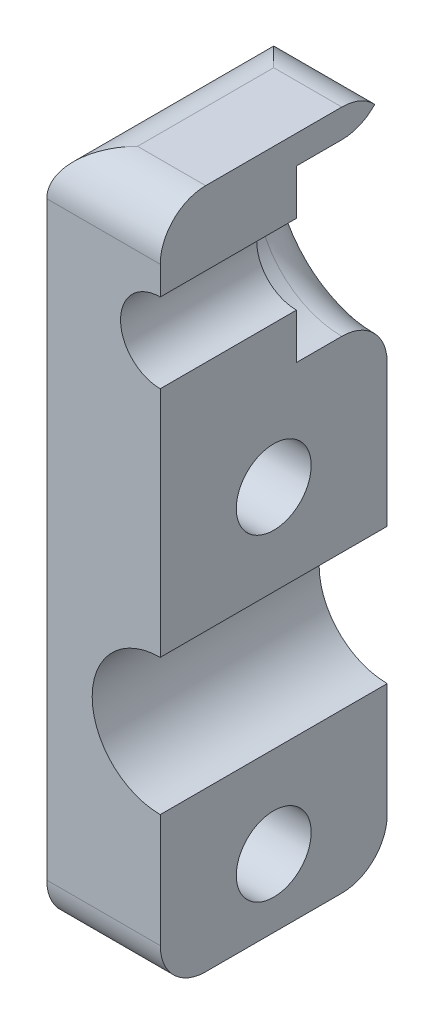
ISO-10303-21;
HEADER;
FILE_DESCRIPTION(('STEP AP214'),'2;1');
FILE_NAME('part.step','',(''),(''),'','','');
FILE_SCHEMA(('AUTOMOTIVE_DESIGN { 1 0 10303 214 1 1 1 1 }'));
ENDSEC;
DATA;
#1=APPLICATION_CONTEXT('core data for automotive mechanical design processes');
#2=APPLICATION_PROTOCOL_DEFINITION('international standard','automotive_design',2000,#1);
#3=PRODUCT_CONTEXT('',#1,'mechanical');
#4=PRODUCT('Part','Part','',(#3));
#5=PRODUCT_RELATED_PRODUCT_CATEGORY('part','',(#4));
#6=PRODUCT_DEFINITION_FORMATION('','',#4);
#7=PRODUCT_DEFINITION_CONTEXT('part definition',#1,'design');
#8=PRODUCT_DEFINITION('design','',#6,#7);
#9=PRODUCT_DEFINITION_SHAPE('','',#8);
#10=(LENGTH_UNIT() NAMED_UNIT(*) SI_UNIT(.MILLI.,.METRE.));
#11=(NAMED_UNIT(*) PLANE_ANGLE_UNIT() SI_UNIT($,.RADIAN.));
#12=(NAMED_UNIT(*) SI_UNIT($,.STERADIAN.) SOLID_ANGLE_UNIT());
#13=UNCERTAINTY_MEASURE_WITH_UNIT(LENGTH_MEASURE(1.E-05),#10,'distance_accuracy_value','');
#14=(GEOMETRIC_REPRESENTATION_CONTEXT(3) GLOBAL_UNCERTAINTY_ASSIGNED_CONTEXT((#13)) GLOBAL_UNIT_ASSIGNED_CONTEXT((#10,
#11,#12)) REPRESENTATION_CONTEXT('',''));
#15=CARTESIAN_POINT('',(0.,0.,0.));
#16=DIRECTION('',(0.,0.,1.));
#17=DIRECTION('',(1.,0.,0.));
#18=AXIS2_PLACEMENT_3D('',#15,#16,#17);
#19=CARTESIAN_POINT('',(0.,0.,0.));
#20=DIRECTION('',(0.,0.,1.));
#21=DIRECTION('',(1.,0.,0.));
#22=AXIS2_PLACEMENT_3D('',#19,#20,#21);
#23=PLANE('',#22);
#24=DIRECTION('',(-1.,0.,0.));
#25=VECTOR('',#24,1.);
#26=CARTESIAN_POINT('',(0.,18.,0.));
#27=LINE('',#26,#25);
#28=CARTESIAN_POINT('',(-5.,18.,0.));
#29=VERTEX_POINT('',#28);
#30=CARTESIAN_POINT('',(-4.90535421758714,18.,0.));
#31=VERTEX_POINT('',#30);
#32=EDGE_CURVE('E285',#29,#31,#27,.F.);
#33=ORIENTED_EDGE('',*,*,#32,.T.);
#34=CARTESIAN_POINT('',(0.,15.,0.));
#35=DIRECTION('',(0.,0.,1.));
#36=DIRECTION('',(1.,0.,0.));
#37=AXIS2_PLACEMENT_3D('',#34,#35,#36);
#38=CIRCLE('',#37,5.75);
#39=CARTESIAN_POINT('',(-5.,17.8394541729001,0.));
#40=VERTEX_POINT('',#39);
#41=EDGE_CURVE('E322',#31,#40,#38,.T.);
#42=ORIENTED_EDGE('',*,*,#41,.T.);
#43=DIRECTION('',(0.,-1.,0.));
#44=VECTOR('',#43,1.);
#45=CARTESIAN_POINT('',(-5.,-10.,0.));
#46=LINE('',#45,#44);
#47=EDGE_CURVE('E248',#29,#40,#46,.T.);
#48=ORIENTED_EDGE('',*,*,#47,.F.);
#49=EDGE_LOOP('',(#33,#42,#48));
#50=FACE_BOUND('',#49,.T.);
#51=ADVANCED_FACE('F38',(#50),#23,.F.);
#52=CARTESIAN_POINT('',(0.,10.,0.));
#53=DIRECTION('',(-1.,0.,0.));
#54=DIRECTION('',(0.,0.,1.));
#55=AXIS2_PLACEMENT_3D('',#52,#53,#54);
#56=PLANE('',#55);
#57=CARTESIAN_POINT('',(0.,7.,5.));
#58=DIRECTION('',(-1.,0.,0.));
#59=DIRECTION('',(0.,0.,1.));
#60=AXIS2_PLACEMENT_3D('',#57,#58,#59);
#61=CIRCLE('',#60,1.65);
#62=CARTESIAN_POINT('',(0.,7.,6.65));
#63=VERTEX_POINT('',#62);
#64=EDGE_CURVE('E206',#63,#63,#61,.F.);
#65=ORIENTED_EDGE('',*,*,#64,.F.);
#66=EDGE_LOOP('',(#65));
#67=FACE_BOUND('',#66,.T.);
#68=DIRECTION('',(0.,-1.,0.));
#69=VECTOR('',#68,1.);
#70=CARTESIAN_POINT('',(0.,10.,0.));
#71=LINE('',#70,#69);
#72=CARTESIAN_POINT('',(0.,9.25,0.));
#73=VERTEX_POINT('',#72);
#74=CARTESIAN_POINT('',(0.,3.,0.));
#75=VERTEX_POINT('',#74);
#76=EDGE_CURVE('E203',#73,#75,#71,.T.);
#77=ORIENTED_EDGE('',*,*,#76,.F.);
#78=CARTESIAN_POINT('',(0.,9.25,2.));
#79=DIRECTION('',(-1.,0.,0.));
#80=DIRECTION('',(0.,0.,1.));
#81=AXIS2_PLACEMENT_3D('',#78,#79,#80);
#82=CIRCLE('',#81,2.);
#83=CARTESIAN_POINT('',(0.,11.25,2.));
#84=VERTEX_POINT('',#83);
#85=EDGE_CURVE('E334',#73,#84,#82,.F.);
#86=ORIENTED_EDGE('',*,*,#85,.T.);
#87=DIRECTION('',(0.,0.,-1.));
#88=VECTOR('',#87,1.);
#89=CARTESIAN_POINT('',(0.,11.25,4.));
#90=LINE('',#89,#88);
#91=CARTESIAN_POINT('',(0.,11.25,4.));
#92=VERTEX_POINT('',#91);
#93=EDGE_CURVE('E162',#92,#84,#90,.T.);
#94=ORIENTED_EDGE('',*,*,#93,.F.);
#95=DIRECTION('',(0.,1.,0.));
#96=VECTOR('',#95,1.);
#97=CARTESIAN_POINT('',(0.,10.,4.));
#98=LINE('',#97,#96);
#99=CARTESIAN_POINT('',(0.,13.25,4.));
#100=VERTEX_POINT('',#99);
#101=EDGE_CURVE('E169',#92,#100,#98,.T.);
#102=ORIENTED_EDGE('',*,*,#101,.T.);
#103=DIRECTION('',(0.,0.,1.));
#104=VECTOR('',#103,1.);
#105=CARTESIAN_POINT('',(0.,13.25,0.));
#106=LINE('',#105,#104);
#107=CARTESIAN_POINT('',(0.,13.25,10.));
#108=VERTEX_POINT('',#107);
#109=EDGE_CURVE('E193',#100,#108,#106,.T.);
#110=ORIENTED_EDGE('',*,*,#109,.T.);
#111=DIRECTION('',(0.,-1.,0.));
#112=VECTOR('',#111,1.);
#113=CARTESIAN_POINT('',(0.,10.,10.));
#114=LINE('',#113,#112);
#115=CARTESIAN_POINT('',(0.,3.,10.));
#116=VERTEX_POINT('',#115);
#117=EDGE_CURVE('E208',#108,#116,#114,.T.);
#118=ORIENTED_EDGE('',*,*,#117,.T.);
#119=DIRECTION('',(0.,0.,-1.));
#120=VECTOR('',#119,1.);
#121=CARTESIAN_POINT('',(0.,3.,10.));
#122=LINE('',#121,#120);
#123=EDGE_CURVE('E218',#116,#75,#122,.T.);
#124=ORIENTED_EDGE('',*,*,#123,.T.);
#125=EDGE_LOOP('',(#77,#86,#94,#102,#110,#118,#124));
#126=FACE_BOUND('',#125,.T.);
#127=ADVANCED_FACE('F372',(#67,#126),#56,.F.);
#128=CARTESIAN_POINT('',(0.,16.75,0.));
#129=DIRECTION('',(1.,0.,0.));
#130=DIRECTION('',(0.,0.,-1.));
#131=AXIS2_PLACEMENT_3D('',#128,#129,#130);
#132=PLANE('',#131);
#133=DIRECTION('',(0.,0.,-1.));
#134=VECTOR('',#133,1.);
#135=CARTESIAN_POINT('',(0.,18.75,4.));
#136=LINE('',#135,#134);
#137=CARTESIAN_POINT('',(0.,18.75,4.));
#138=VERTEX_POINT('',#137);
#139=CARTESIAN_POINT('',(0.,18.75,2.));
#140=VERTEX_POINT('',#139);
#141=EDGE_CURVE('E155',#138,#140,#136,.T.);
#142=ORIENTED_EDGE('',*,*,#141,.T.);
#143=CARTESIAN_POINT('',(0.,20.75,2.));
#144=DIRECTION('',(1.,0.,0.));
#145=DIRECTION('',(0.,0.,-1.));
#146=AXIS2_PLACEMENT_3D('',#143,#144,#145);
#147=CIRCLE('',#146,2.);
#148=CARTESIAN_POINT('',(0.,19.375,0.547631245172217));
#149=VERTEX_POINT('',#148);
#150=EDGE_CURVE('E53',#140,#149,#147,.T.);
#151=ORIENTED_EDGE('',*,*,#150,.T.);
#152=CARTESIAN_POINT('',(0.,18.,2.));
#153=DIRECTION('',(1.,0.,0.));
#154=DIRECTION('',(0.,0.,-1.));
#155=AXIS2_PLACEMENT_3D('',#152,#153,#154);
#156=CIRCLE('',#155,2.);
#157=CARTESIAN_POINT('',(0.,20.,2.));
#158=VERTEX_POINT('',#157);
#159=EDGE_CURVE('E275',#149,#158,#156,.T.);
#160=ORIENTED_EDGE('',*,*,#159,.T.);
#161=DIRECTION('',(0.,0.,1.));
#162=VECTOR('',#161,1.);
#163=CARTESIAN_POINT('',(0.,20.,0.));
#164=LINE('',#163,#162);
#165=CARTESIAN_POINT('',(0.,20.,8.));
#166=VERTEX_POINT('',#165);
#167=EDGE_CURVE('E194',#158,#166,#164,.T.);
#168=ORIENTED_EDGE('',*,*,#167,.T.);
#169=CARTESIAN_POINT('',(0.,18.,8.));
#170=DIRECTION('',(1.,0.,0.));
#171=DIRECTION('',(0.,0.,-1.));
#172=AXIS2_PLACEMENT_3D('',#169,#170,#171);
#173=CIRCLE('',#172,2.);
#174=CARTESIAN_POINT('',(0.,18.,10.));
#175=VERTEX_POINT('',#174);
#176=EDGE_CURVE('E278',#166,#175,#173,.T.);
#177=ORIENTED_EDGE('',*,*,#176,.T.);
#178=DIRECTION('',(0.,1.,0.));
#179=VECTOR('',#178,1.);
#180=CARTESIAN_POINT('',(0.,16.75,10.));
#181=LINE('',#180,#179);
#182=CARTESIAN_POINT('',(0.,16.75,10.));
#183=VERTEX_POINT('',#182);
#184=EDGE_CURVE('E188',#183,#175,#181,.T.);
#185=ORIENTED_EDGE('',*,*,#184,.F.);
#186=DIRECTION('',(0.,0.,1.));
#187=VECTOR('',#186,1.);
#188=CARTESIAN_POINT('',(0.,16.75,0.));
#189=LINE('',#188,#187);
#190=CARTESIAN_POINT('',(0.,16.75,4.));
#191=VERTEX_POINT('',#190);
#192=EDGE_CURVE('E175',#191,#183,#189,.T.);
#193=ORIENTED_EDGE('',*,*,#192,.F.);
#194=DIRECTION('',(0.,-1.,0.));
#195=VECTOR('',#194,1.);
#196=CARTESIAN_POINT('',(0.,16.75,4.));
#197=LINE('',#196,#195);
#198=EDGE_CURVE('E166',#138,#191,#197,.T.);
#199=ORIENTED_EDGE('',*,*,#198,.F.);
#200=EDGE_LOOP('',(#142,#151,#160,#168,#177,#185,#193,#199));
#201=FACE_BOUND('',#200,.T.);
#202=ADVANCED_FACE('F173',(#201),#132,.T.);
#203=CARTESIAN_POINT('',(-5.,18.,2.));
#204=DIRECTION('',(1.,0.,0.));
#205=DIRECTION('',(0.,0.,-1.));
#206=AXIS2_PLACEMENT_3D('',#203,#204,#205);
#207=CYLINDRICAL_SURFACE('',#206,2.);
#208=ORIENTED_EDGE('',*,*,#159,.F.);
#209=CARTESIAN_POINT('',(0.,19.375,0.547631245172218));
#210=CARTESIAN_POINT('',(-0.104557431719242,19.3750058942445,0.547664145378404));
#211=CARTESIAN_POINT('',(-0.209105424218425,19.3731261124907,0.545857579252085));
#212=CARTESIAN_POINT('',(-0.417915039496504,19.3656408977922,0.538811350696752));
#213=CARTESIAN_POINT('',(-0.522176753405376,19.3600368344377,0.533572950321554));
#214=CARTESIAN_POINT('',(-0.729936395654217,19.3451692427591,0.519927411811523));
#215=CARTESIAN_POINT('',(-0.833435637846198,19.3359158577942,0.511529059770388));
#216=CARTESIAN_POINT('',(-1.0397920197455,19.3138275183705,0.491996336406392));
#217=CARTESIAN_POINT('',(-1.14264910290823,19.3009922529368,0.48086172753477));
#218=CARTESIAN_POINT('',(-1.45026658123059,19.2572165551883,0.444088131758686));
#219=CARTESIAN_POINT('',(-1.65389423232931,19.2210192801474,0.415092772692857));
#220=CARTESIAN_POINT('',(-2.0577274131272,19.1353768580384,0.352663854281344));
#221=CARTESIAN_POINT('',(-2.25793034852994,19.0859221031891,0.319227085118304));
#222=CARTESIAN_POINT('',(-2.66837993582481,18.9706964695246,0.249980036452149));
#223=CARTESIAN_POINT('',(-2.87837725016599,18.9040411286758,0.2141638024368));
#224=CARTESIAN_POINT('',(-3.29440958221754,18.7572932347844,0.147159496697465));
#225=CARTESIAN_POINT('',(-3.50044432568652,18.6771997554192,0.115971744305104));
#226=CARTESIAN_POINT('',(-3.90764586560315,18.5048059668876,0.0626590613426096));
#227=CARTESIAN_POINT('',(-4.10882793408878,18.4125522310438,0.0405008103494129));
#228=CARTESIAN_POINT('',(-4.50657842964537,18.2167270088505,0.00930835211263196));
#229=CARTESIAN_POINT('',(-4.70315098626129,18.1131661626594,0.00026191897933822));
#230=CARTESIAN_POINT('',(-4.89972236801897,18.0031559260471,1.87237790598722E-06));
#231=CARTESIAN_POINT('',(-4.90253859153695,18.0015784767274,3.8154487452337E-09));
#232=CARTESIAN_POINT('',(-4.90535421758714,18.,0.));
#233=B_SPLINE_CURVE_WITH_KNOTS('',3,(#209,#210,#211,#212,#213,#214,#215,#216,#217,#218,#219,
#220,#221,#222,#223,#224,#225,#226,#227,#228,#229,#230,#231,#232),.UNSPECIFIED.,.F.,.F.,(4,2,2,
2,2,2,2,2,2,2,2,4),(0.,0.313624479183911,0.627133687953784,0.939777564889495,1.25244859366927,
1.87832878739126,2.50466379251131,3.17382805908076,3.84303847168451,4.50975651797908,
5.17585249363781,5.18553624948097),.UNSPECIFIED.);
#234=EDGE_CURVE('E11',#149,#31,#233,.T.);
#235=ORIENTED_EDGE('',*,*,#234,.T.);
#236=ORIENTED_EDGE('',*,*,#32,.F.);
#237=CARTESIAN_POINT('',(-3.,18.,2.));
#238=DIRECTION('',(0.707106781186547,0.,-0.707106781186547));
#239=DIRECTION('',(-0.707106781186547,0.,-0.707106781186547));
#240=AXIS2_PLACEMENT_3D('',#237,#238,#239);
#241=ELLIPSE('',#240,2.82842712474619,2.);
#242=CARTESIAN_POINT('',(-3.,20.,2.));
#243=VERTEX_POINT('',#242);
#244=EDGE_CURVE('E189',#243,#29,#241,.F.);
#245=ORIENTED_EDGE('',*,*,#244,.F.);
#246=DIRECTION('',(-1.,0.,0.));
#247=VECTOR('',#246,1.);
#248=CARTESIAN_POINT('',(-5.,20.,2.));
#249=LINE('',#248,#247);
#250=EDGE_CURVE('E269',#158,#243,#249,.T.);
#251=ORIENTED_EDGE('',*,*,#250,.F.);
#252=EDGE_LOOP('',(#208,#235,#236,#245,#251));
#253=FACE_BOUND('',#252,.T.);
#254=ADVANCED_FACE('F354',(#253),#207,.T.);
#255=CARTESIAN_POINT('',(0.,0.,10.));
#256=DIRECTION('',(0.,0.,1.));
#257=DIRECTION('',(1.,0.,0.));
#258=AXIS2_PLACEMENT_3D('',#255,#256,#257);
#259=PLANE('',#258);
#260=ORIENTED_EDGE('',*,*,#184,.T.);
#261=DIRECTION('',(-1.,0.,0.));
#262=VECTOR('',#261,1.);
#263=CARTESIAN_POINT('',(0.,18.,10.));
#264=LINE('',#263,#262);
#265=CARTESIAN_POINT('',(-5.,18.,10.));
#266=VERTEX_POINT('',#265);
#267=EDGE_CURVE('E262',#175,#266,#264,.T.);
#268=ORIENTED_EDGE('',*,*,#267,.T.);
#269=DIRECTION('',(0.,-1.,0.));
#270=VECTOR('',#269,1.);
#271=CARTESIAN_POINT('',(-5.,-10.,10.));
#272=LINE('',#271,#270);
#273=CARTESIAN_POINT('',(-5.,-8.,10.));
#274=VERTEX_POINT('',#273);
#275=EDGE_CURVE('E243',#266,#274,#272,.T.);
#276=ORIENTED_EDGE('',*,*,#275,.T.);
#277=DIRECTION('',(1.,0.,0.));
#278=VECTOR('',#277,1.);
#279=CARTESIAN_POINT('',(0.,-8.,10.));
#280=LINE('',#279,#278);
#281=CARTESIAN_POINT('',(0.,-8.,10.));
#282=VERTEX_POINT('',#281);
#283=EDGE_CURVE('E255',#274,#282,#280,.T.);
#284=ORIENTED_EDGE('',*,*,#283,.T.);
#285=CARTESIAN_POINT('',(0.,-3.,10.));
#286=VERTEX_POINT('',#285);
#287=EDGE_CURVE('E198',#286,#282,#114,.T.);
#288=ORIENTED_EDGE('',*,*,#287,.F.);
#289=CARTESIAN_POINT('',(0.,0.,10.));
#290=DIRECTION('',(0.,0.,1.));
#291=DIRECTION('',(1.,0.,0.));
#292=AXIS2_PLACEMENT_3D('',#289,#290,#291);
#293=CIRCLE('',#292,3.);
#294=EDGE_CURVE('E235',#116,#286,#293,.T.);
#295=ORIENTED_EDGE('',*,*,#294,.F.);
#296=ORIENTED_EDGE('',*,*,#117,.F.);
#297=CARTESIAN_POINT('',(0.,15.,10.));
#298=DIRECTION('',(0.,0.,-1.));
#299=DIRECTION('',(1.,0.,0.));
#300=AXIS2_PLACEMENT_3D('',#297,#298,#299);
#301=CIRCLE('',#300,1.75);
#302=EDGE_CURVE('E184',#108,#183,#301,.T.);
#303=ORIENTED_EDGE('',*,*,#302,.T.);
#304=EDGE_LOOP('',(#260,#268,#276,#284,#288,#295,#296,#303));
#305=FACE_BOUND('',#304,.T.);
#306=ADVANCED_FACE('F358',(#305),#259,.T.);
#307=CARTESIAN_POINT('',(-5.,12.1605458270999,0.));
#308=VERTEX_POINT('',#307);
#309=CARTESIAN_POINT('',(-5.,-8.,0.));
#310=VERTEX_POINT('',#309);
#311=EDGE_CURVE('E239',#308,#310,#46,.T.);
#312=ORIENTED_EDGE('',*,*,#311,.F.);
#313=CARTESIAN_POINT('',(0.,15.,0.));
#314=DIRECTION('',(0.,0.,1.));
#315=DIRECTION('',(1.,0.,0.));
#316=AXIS2_PLACEMENT_3D('',#313,#314,#315);
#317=CIRCLE('',#316,5.75);
#318=EDGE_CURVE('E319',#308,#73,#317,.T.);
#319=ORIENTED_EDGE('',*,*,#318,.T.);
#320=ORIENTED_EDGE('',*,*,#76,.T.);
#321=CARTESIAN_POINT('',(0.,0.,0.));
#322=DIRECTION('',(0.,0.,1.));
#323=DIRECTION('',(1.,0.,0.));
#324=AXIS2_PLACEMENT_3D('',#321,#322,#323);
#325=CIRCLE('',#324,3.);
#326=CARTESIAN_POINT('',(0.,-3.,0.));
#327=VERTEX_POINT('',#326);
#328=EDGE_CURVE('E231',#75,#327,#325,.T.);
#329=ORIENTED_EDGE('',*,*,#328,.T.);
#330=CARTESIAN_POINT('',(0.,-8.,0.));
#331=VERTEX_POINT('',#330);
#332=EDGE_CURVE('E207',#327,#331,#71,.T.);
#333=ORIENTED_EDGE('',*,*,#332,.T.);
#334=DIRECTION('',(1.,0.,0.));
#335=VECTOR('',#334,1.);
#336=CARTESIAN_POINT('',(0.,-8.,0.));
#337=LINE('',#336,#335);
#338=EDGE_CURVE('E281',#331,#310,#337,.F.);
#339=ORIENTED_EDGE('',*,*,#338,.T.);
#340=EDGE_LOOP('',(#312,#319,#320,#329,#333,#339));
#341=FACE_BOUND('',#340,.T.);
#342=ADVANCED_FACE('F342',(#341),#23,.F.);
#343=CARTESIAN_POINT('',(-5.,-10.,10.));
#344=DIRECTION('',(1.,0.,0.));
#345=DIRECTION('',(0.,0.,-1.));
#346=AXIS2_PLACEMENT_3D('',#343,#344,#345);
#347=PLANE('',#346);
#348=CARTESIAN_POINT('',(-5.,7.,5.));
#349=DIRECTION('',(-1.,0.,0.));
#350=DIRECTION('',(0.,0.,1.));
#351=AXIS2_PLACEMENT_3D('',#348,#349,#350);
#352=CIRCLE('',#351,1.65);
#353=CARTESIAN_POINT('',(-5.,7.,6.65));
#354=VERTEX_POINT('',#353);
#355=EDGE_CURVE('E227',#354,#354,#352,.T.);
#356=ORIENTED_EDGE('',*,*,#355,.F.);
#357=EDGE_LOOP('',(#356));
#358=FACE_BOUND('',#357,.T.);
#359=CARTESIAN_POINT('',(-5.,-7.,5.));
#360=DIRECTION('',(-1.,0.,0.));
#361=DIRECTION('',(0.,0.,1.));
#362=AXIS2_PLACEMENT_3D('',#359,#360,#361);
#363=CIRCLE('',#362,1.65);
#364=CARTESIAN_POINT('',(-5.,-7.,6.65));
#365=VERTEX_POINT('',#364);
#366=EDGE_CURVE('E226',#365,#365,#363,.T.);
#367=ORIENTED_EDGE('',*,*,#366,.F.);
#368=EDGE_LOOP('',(#367));
#369=FACE_BOUND('',#368,.T.);
#370=ORIENTED_EDGE('',*,*,#47,.T.);
#371=CARTESIAN_POINT('',(-5.,17.8394541729001,0.));
#372=CARTESIAN_POINT('',(-5.,17.7559573230631,1.5059673643392E-06));
#373=CARTESIAN_POINT('',(-5.,17.6724743884027,0.00127486166122521));
#374=CARTESIAN_POINT('',(-5.,17.5056285933237,0.00586466086511358));
#375=CARTESIAN_POINT('',(-5.,17.4222656901372,0.00917949143915023));
#376=CARTESIAN_POINT('',(-5.,17.2556441903361,0.0173520364408328));
#377=CARTESIAN_POINT('',(-5.,17.1723855707008,0.0222093091210928));
#378=CARTESIAN_POINT('',(-5.,17.0058951499512,0.0329841618126697));
#379=CARTESIAN_POINT('',(-5.,16.9226633849223,0.0389022883872981));
#380=CARTESIAN_POINT('',(-5.,16.6722366155333,0.0575814037255051));
#381=CARTESIAN_POINT('',(-5.,16.5051101386614,0.071218626195395));
#382=CARTESIAN_POINT('',(-5.,16.1707516000933,0.0971121286841212));
#383=CARTESIAN_POINT('',(-5.,16.0035195444876,0.109368482134822));
#384=CARTESIAN_POINT('',(-5.,15.6690030306002,0.129326968154269));
#385=CARTESIAN_POINT('',(-5.,15.5017190040156,0.137035713033512));
#386=CARTESIAN_POINT('',(-5.,15.1669917240203,0.145908666501976));
#387=CARTESIAN_POINT('',(-5.,14.9995485048876,0.147074058727873));
#388=CARTESIAN_POINT('',(-5.,14.6648288031768,0.1425540012047));
#389=CARTESIAN_POINT('',(-5.,14.497552281004,0.136871229895289));
#390=CARTESIAN_POINT('',(-5.,14.1632477927315,0.120154943397628));
#391=CARTESIAN_POINT('',(-5.,13.9962199017374,0.109120050597252));
#392=CARTESIAN_POINT('',(-5.,13.6621672343864,0.0845263939112008));
#393=CARTESIAN_POINT('',(-5.,13.4951427027134,0.0709646146373417));
#394=CARTESIAN_POINT('',(-5.,13.1610104624375,0.0448943826760341));
#395=CARTESIAN_POINT('',(-5.,12.9939027617324,0.0323858441431447));
#396=CARTESIAN_POINT('',(-5.,12.7711849940085,0.0190051070471635));
#397=CARTESIAN_POINT('',(-5.,12.7157120844865,0.0159437200288434));
#398=CARTESIAN_POINT('',(-5.,12.6047448860697,0.0105077558482934));
#399=CARTESIAN_POINT('',(-5.,12.5492506048072,0.00813302410736663));
#400=CARTESIAN_POINT('',(-5.,12.4382396677601,0.0042152460184918));
#401=CARTESIAN_POINT('',(-5.,12.382723016427,0.002672078255604));
#402=CARTESIAN_POINT('',(-5.,12.271653825586,0.000564448895834083));
#403=CARTESIAN_POINT('',(-5.,12.216101280279,3.00213052616789E-07));
#404=CARTESIAN_POINT('',(-5.,12.1605458270999,0.));
#405=B_SPLINE_CURVE_WITH_KNOTS('',3,(#371,#372,#373,#374,#375,#376,#377,#378,#379,#380,#381,
#382,#383,#384,#385,#386,#387,#388,#389,#390,#391,#392,#393,#394,#395,#396,#397,#398,#399,#400,
#401,#402,#403,#404),.UNSPECIFIED.,.F.,.F.,(4,2,2,2,2,2,2,2,2,2,2,2,2,2,2,2,4),(0.,
0.250461062038237,0.50072449229396,0.750916312950249,1.00123740755499,1.50428365664162,
2.00730314209132,2.50958941320708,3.01178482209336,3.51378387707528,4.01591221299518,
4.51864363234092,5.02133403631511,5.18800200505312,5.35463242451112,5.52123850800891,
5.68789783234607),.UNSPECIFIED.);
#406=EDGE_CURVE('E326',#40,#308,#405,.T.);
#407=ORIENTED_EDGE('',*,*,#406,.T.);
#408=ORIENTED_EDGE('',*,*,#311,.T.);
#409=CARTESIAN_POINT('',(-5.,-8.,2.));
#410=DIRECTION('',(1.,0.,0.));
#411=DIRECTION('',(0.,0.,-1.));
#412=AXIS2_PLACEMENT_3D('',#409,#410,#411);
#413=CIRCLE('',#412,2.);
#414=CARTESIAN_POINT('',(-5.,-10.,2.));
#415=VERTEX_POINT('',#414);
#416=EDGE_CURVE('E308',#310,#415,#413,.F.);
#417=ORIENTED_EDGE('',*,*,#416,.T.);
#418=DIRECTION('',(0.,0.,-1.));
#419=VECTOR('',#418,1.);
#420=CARTESIAN_POINT('',(-5.,-10.,10.));
#421=LINE('',#420,#419);
#422=CARTESIAN_POINT('',(-5.,-10.,8.));
#423=VERTEX_POINT('',#422);
#424=EDGE_CURVE('E247',#423,#415,#421,.T.);
#425=ORIENTED_EDGE('',*,*,#424,.F.);
#426=CARTESIAN_POINT('',(-5.,-8.,8.));
#427=DIRECTION('',(1.,0.,0.));
#428=DIRECTION('',(0.,0.,-1.));
#429=AXIS2_PLACEMENT_3D('',#426,#427,#428);
#430=CIRCLE('',#429,2.);
#431=EDGE_CURVE('E305',#423,#274,#430,.F.);
#432=ORIENTED_EDGE('',*,*,#431,.T.);
#433=ORIENTED_EDGE('',*,*,#275,.F.);
#434=DIRECTION('',(0.,0.,1.));
#435=VECTOR('',#434,1.);
#436=CARTESIAN_POINT('',(-5.,18.,0.));
#437=LINE('',#436,#435);
#438=EDGE_CURVE('E302',#266,#29,#437,.F.);
#439=ORIENTED_EDGE('',*,*,#438,.T.);
#440=EDGE_LOOP('',(#370,#407,#408,#417,#425,#432,#433,#439));
#441=FACE_BOUND('',#440,.T.);
#442=ADVANCED_FACE('F336',(#358,#369,#441),#347,.F.);
#443=CARTESIAN_POINT('',(5.,-10.,10.));
#444=DIRECTION('',(0.,1.,0.));
#445=DIRECTION('',(0.,0.,1.));
#446=AXIS2_PLACEMENT_3D('',#443,#444,#445);
#447=PLANE('',#446);
#448=ORIENTED_EDGE('',*,*,#424,.T.);
#449=DIRECTION('',(1.,0.,0.));
#450=VECTOR('',#449,1.);
#451=CARTESIAN_POINT('',(5.,-10.,2.));
#452=LINE('',#451,#450);
#453=CARTESIAN_POINT('',(0.,-10.,2.));
#454=VERTEX_POINT('',#453);
#455=EDGE_CURVE('E292',#415,#454,#452,.T.);
#456=ORIENTED_EDGE('',*,*,#455,.T.);
#457=DIRECTION('',(0.,0.,1.));
#458=VECTOR('',#457,1.);
#459=CARTESIAN_POINT('',(0.,-10.,10.));
#460=LINE('',#459,#458);
#461=CARTESIAN_POINT('',(0.,-10.,8.));
#462=VERTEX_POINT('',#461);
#463=EDGE_CURVE('E222',#454,#462,#460,.T.);
#464=ORIENTED_EDGE('',*,*,#463,.T.);
#465=DIRECTION('',(1.,0.,0.));
#466=VECTOR('',#465,1.);
#467=CARTESIAN_POINT('',(-5.,-10.,8.));
#468=LINE('',#467,#466);
#469=EDGE_CURVE('E289',#462,#423,#468,.F.);
#470=ORIENTED_EDGE('',*,*,#469,.T.);
#471=EDGE_LOOP('',(#448,#456,#464,#470));
#472=FACE_BOUND('',#471,.T.);
#473=ADVANCED_FACE('F341',(#472),#447,.F.);
#474=CARTESIAN_POINT('',(0.,0.,10.));
#475=DIRECTION('',(0.,0.,-1.));
#476=DIRECTION('',(-1.,0.,0.));
#477=AXIS2_PLACEMENT_3D('',#474,#475,#476);
#478=CYLINDRICAL_SURFACE('',#477,3.);
#479=ORIENTED_EDGE('',*,*,#123,.F.);
#480=ORIENTED_EDGE('',*,*,#294,.T.);
#481=DIRECTION('',(0.,0.,-1.));
#482=VECTOR('',#481,1.);
#483=CARTESIAN_POINT('',(0.,-3.,10.));
#484=LINE('',#483,#482);
#485=EDGE_CURVE('E215',#327,#286,#484,.F.);
#486=ORIENTED_EDGE('',*,*,#485,.F.);
#487=ORIENTED_EDGE('',*,*,#328,.F.);
#488=EDGE_LOOP('',(#479,#480,#486,#487));
#489=FACE_BOUND('',#488,.T.);
#490=ADVANCED_FACE('F415',(#489),#478,.F.);
#491=CARTESIAN_POINT('',(5.,-7.,5.));
#492=DIRECTION('',(-1.,0.,0.));
#493=DIRECTION('',(0.,0.,1.));
#494=AXIS2_PLACEMENT_3D('',#491,#492,#493);
#495=CYLINDRICAL_SURFACE('',#494,1.65);
#496=CARTESIAN_POINT('',(0.,-7.,5.));
#497=DIRECTION('',(-1.,0.,0.));
#498=DIRECTION('',(0.,0.,1.));
#499=AXIS2_PLACEMENT_3D('',#496,#497,#498);
#500=CIRCLE('',#499,1.65);
#501=CARTESIAN_POINT('',(0.,-7.,6.65));
#502=VERTEX_POINT('',#501);
#503=EDGE_CURVE('E211',#502,#502,#500,.F.);
#504=ORIENTED_EDGE('',*,*,#503,.T.);
#505=EDGE_LOOP('',(#504));
#506=FACE_BOUND('',#505,.T.);
#507=ORIENTED_EDGE('',*,*,#366,.T.);
#508=EDGE_LOOP('',(#507));
#509=FACE_BOUND('',#508,.T.);
#510=ADVANCED_FACE('F451',(#506,#509),#495,.F.);
#511=CARTESIAN_POINT('',(5.,7.,5.));
#512=DIRECTION('',(-1.,0.,0.));
#513=DIRECTION('',(0.,0.,1.));
#514=AXIS2_PLACEMENT_3D('',#511,#512,#513);
#515=CYLINDRICAL_SURFACE('',#514,1.65);
#516=ORIENTED_EDGE('',*,*,#64,.T.);
#517=EDGE_LOOP('',(#516));
#518=FACE_BOUND('',#517,.T.);
#519=ORIENTED_EDGE('',*,*,#355,.T.);
#520=EDGE_LOOP('',(#519));
#521=FACE_BOUND('',#520,.T.);
#522=ADVANCED_FACE('F443',(#518,#521),#515,.F.);
#523=ORIENTED_EDGE('',*,*,#503,.F.);
#524=EDGE_LOOP('',(#523));
#525=FACE_BOUND('',#524,.T.);
#526=ORIENTED_EDGE('',*,*,#463,.F.);
#527=CARTESIAN_POINT('',(0.,-8.,2.));
#528=DIRECTION('',(-1.,0.,0.));
#529=DIRECTION('',(0.,0.,1.));
#530=AXIS2_PLACEMENT_3D('',#527,#528,#529);
#531=CIRCLE('',#530,2.);
#532=EDGE_CURVE('E299',#454,#331,#531,.F.);
#533=ORIENTED_EDGE('',*,*,#532,.T.);
#534=ORIENTED_EDGE('',*,*,#332,.F.);
#535=ORIENTED_EDGE('',*,*,#485,.T.);
#536=ORIENTED_EDGE('',*,*,#287,.T.);
#537=CARTESIAN_POINT('',(0.,-8.,8.));
#538=DIRECTION('',(-1.,0.,0.));
#539=DIRECTION('',(0.,0.,1.));
#540=AXIS2_PLACEMENT_3D('',#537,#538,#539);
#541=CIRCLE('',#540,2.);
#542=EDGE_CURVE('E296',#282,#462,#541,.F.);
#543=ORIENTED_EDGE('',*,*,#542,.T.);
#544=EDGE_LOOP('',(#526,#533,#534,#535,#536,#543));
#545=FACE_BOUND('',#544,.T.);
#546=ADVANCED_FACE('F380',(#525,#545),#56,.F.);
#547=CARTESIAN_POINT('',(-5.,20.,0.));
#548=DIRECTION('',(0.,1.,0.));
#549=DIRECTION('',(0.,0.,1.));
#550=AXIS2_PLACEMENT_3D('',#547,#548,#549);
#551=PLANE('',#550);
#552=DIRECTION('',(0.,0.,1.));
#553=VECTOR('',#552,1.);
#554=CARTESIAN_POINT('',(-3.,20.,10.));
#555=LINE('',#554,#553);
#556=CARTESIAN_POINT('',(-3.,20.,8.));
#557=VERTEX_POINT('',#556);
#558=EDGE_CURVE('E266',#243,#557,#555,.T.);
#559=ORIENTED_EDGE('',*,*,#558,.T.);
#560=DIRECTION('',(-1.,0.,0.));
#561=VECTOR('',#560,1.);
#562=CARTESIAN_POINT('',(-5.,20.,8.));
#563=LINE('',#562,#561);
#564=EDGE_CURVE('E272',#557,#166,#563,.F.);
#565=ORIENTED_EDGE('',*,*,#564,.T.);
#566=ORIENTED_EDGE('',*,*,#167,.F.);
#567=ORIENTED_EDGE('',*,*,#250,.T.);
#568=EDGE_LOOP('',(#559,#565,#566,#567));
#569=FACE_BOUND('',#568,.T.);
#570=ADVANCED_FACE('F434',(#569),#551,.T.);
#571=CARTESIAN_POINT('',(0.,15.,0.));
#572=DIRECTION('',(0.,0.,1.));
#573=DIRECTION('',(1.,0.,0.));
#574=AXIS2_PLACEMENT_3D('',#571,#572,#573);
#575=CYLINDRICAL_SURFACE('',#574,1.75);
#576=CARTESIAN_POINT('',(0.,15.,4.));
#577=DIRECTION('',(0.,0.,1.));
#578=DIRECTION('',(1.,0.,0.));
#579=AXIS2_PLACEMENT_3D('',#576,#577,#578);
#580=CIRCLE('',#579,1.75);
#581=EDGE_CURVE('E311',#191,#100,#580,.T.);
#582=ORIENTED_EDGE('',*,*,#581,.F.);
#583=ORIENTED_EDGE('',*,*,#192,.T.);
#584=ORIENTED_EDGE('',*,*,#302,.F.);
#585=ORIENTED_EDGE('',*,*,#109,.F.);
#586=EDGE_LOOP('',(#582,#583,#584,#585));
#587=FACE_BOUND('',#586,.T.);
#588=ADVANCED_FACE('F352',(#587),#575,.F.);
#589=CARTESIAN_POINT('',(-3.,18.,0.));
#590=DIRECTION('',(0.,0.,-1.));
#591=DIRECTION('',(-1.,0.,0.));
#592=AXIS2_PLACEMENT_3D('',#589,#590,#591);
#593=CYLINDRICAL_SURFACE('',#592,2.);
#594=ORIENTED_EDGE('',*,*,#244,.T.);
#595=ORIENTED_EDGE('',*,*,#438,.F.);
#596=CARTESIAN_POINT('',(-3.,18.,8.));
#597=DIRECTION('',(-0.707106781186547,0.,-0.707106781186547));
#598=DIRECTION('',(0.707106781186547,0.,-0.707106781186547));
#599=AXIS2_PLACEMENT_3D('',#596,#597,#598);
#600=ELLIPSE('',#599,2.82842712474619,2.);
#601=EDGE_CURVE('E180',#557,#266,#600,.F.);
#602=ORIENTED_EDGE('',*,*,#601,.F.);
#603=ORIENTED_EDGE('',*,*,#558,.F.);
#604=EDGE_LOOP('',(#594,#595,#602,#603));
#605=FACE_BOUND('',#604,.T.);
#606=ADVANCED_FACE('F349',(#605),#593,.T.);
#607=CARTESIAN_POINT('',(0.,18.,8.));
#608=DIRECTION('',(-1.,0.,0.));
#609=DIRECTION('',(0.,0.,1.));
#610=AXIS2_PLACEMENT_3D('',#607,#608,#609);
#611=CYLINDRICAL_SURFACE('',#610,2.);
#612=ORIENTED_EDGE('',*,*,#176,.F.);
#613=ORIENTED_EDGE('',*,*,#564,.F.);
#614=ORIENTED_EDGE('',*,*,#601,.T.);
#615=ORIENTED_EDGE('',*,*,#267,.F.);
#616=EDGE_LOOP('',(#612,#613,#614,#615));
#617=FACE_BOUND('',#616,.T.);
#618=ADVANCED_FACE('F345',(#617),#611,.T.);
#619=CARTESIAN_POINT('',(5.,-8.,2.));
#620=DIRECTION('',(1.,0.,0.));
#621=DIRECTION('',(0.,0.,-1.));
#622=AXIS2_PLACEMENT_3D('',#619,#620,#621);
#623=CYLINDRICAL_SURFACE('',#622,2.);
#624=ORIENTED_EDGE('',*,*,#416,.F.);
#625=ORIENTED_EDGE('',*,*,#338,.F.);
#626=ORIENTED_EDGE('',*,*,#532,.F.);
#627=ORIENTED_EDGE('',*,*,#455,.F.);
#628=EDGE_LOOP('',(#624,#625,#626,#627));
#629=FACE_BOUND('',#628,.T.);
#630=ADVANCED_FACE('F348',(#629),#623,.T.);
#631=CARTESIAN_POINT('',(0.,-8.,8.));
#632=DIRECTION('',(-1.,0.,0.));
#633=DIRECTION('',(0.,0.,1.));
#634=AXIS2_PLACEMENT_3D('',#631,#632,#633);
#635=CYLINDRICAL_SURFACE('',#634,2.);
#636=ORIENTED_EDGE('',*,*,#431,.F.);
#637=ORIENTED_EDGE('',*,*,#469,.F.);
#638=ORIENTED_EDGE('',*,*,#542,.F.);
#639=ORIENTED_EDGE('',*,*,#283,.F.);
#640=EDGE_LOOP('',(#636,#637,#638,#639));
#641=FACE_BOUND('',#640,.T.);
#642=ADVANCED_FACE('F361',(#641),#635,.T.);
#643=CARTESIAN_POINT('',(0.,15.,4.));
#644=DIRECTION('',(0.,0.,1.));
#645=DIRECTION('',(1.,0.,0.));
#646=AXIS2_PLACEMENT_3D('',#643,#644,#645);
#647=PLANE('',#646);
#648=CARTESIAN_POINT('',(0.,15.,4.));
#649=DIRECTION('',(0.,0.,1.));
#650=DIRECTION('',(1.,0.,0.));
#651=AXIS2_PLACEMENT_3D('',#648,#649,#650);
#652=CIRCLE('',#651,3.75);
#653=EDGE_CURVE('E158',#138,#92,#652,.T.);
#654=ORIENTED_EDGE('',*,*,#653,.F.);
#655=ORIENTED_EDGE('',*,*,#198,.T.);
#656=ORIENTED_EDGE('',*,*,#581,.T.);
#657=ORIENTED_EDGE('',*,*,#101,.F.);
#658=EDGE_LOOP('',(#654,#655,#656,#657));
#659=FACE_BOUND('',#658,.T.);
#660=ADVANCED_FACE('F165',(#659),#647,.F.);
#661=CARTESIAN_POINT('',(0.,15.,4.));
#662=DIRECTION('',(0.,0.,-1.));
#663=DIRECTION('',(-1.,0.,0.));
#664=AXIS2_PLACEMENT_3D('',#661,#662,#663);
#665=CYLINDRICAL_SURFACE('',#664,3.75);
#666=ORIENTED_EDGE('',*,*,#93,.T.);
#667=CARTESIAN_POINT('',(0.,15.,2.));
#668=DIRECTION('',(0.,0.,1.));
#669=DIRECTION('',(1.,0.,0.));
#670=AXIS2_PLACEMENT_3D('',#667,#668,#669);
#671=CIRCLE('',#670,3.75);
#672=EDGE_CURVE('E67',#84,#140,#671,.F.);
#673=ORIENTED_EDGE('',*,*,#672,.T.);
#674=ORIENTED_EDGE('',*,*,#141,.F.);
#675=ORIENTED_EDGE('',*,*,#653,.T.);
#676=EDGE_LOOP('',(#666,#673,#674,#675));
#677=FACE_BOUND('',#676,.T.);
#678=ADVANCED_FACE('F157',(#677),#665,.F.);
#679=CARTESIAN_POINT('',(0.,15.,2.));
#680=DIRECTION('',(0.,0.,1.));
#681=DIRECTION('',(1.,0.,0.));
#682=AXIS2_PLACEMENT_3D('',#679,#680,#681);
#683=TOROIDAL_SURFACE('',#682,5.75,2.);
#684=ORIENTED_EDGE('',*,*,#150,.F.);
#685=ORIENTED_EDGE('',*,*,#672,.F.);
#686=ORIENTED_EDGE('',*,*,#85,.F.);
#687=ORIENTED_EDGE('',*,*,#318,.F.);
#688=ORIENTED_EDGE('',*,*,#406,.F.);
#689=ORIENTED_EDGE('',*,*,#41,.F.);
#690=ORIENTED_EDGE('',*,*,#234,.F.);
#691=EDGE_LOOP('',(#684,#685,#686,#687,#688,#689,#690));
#692=FACE_BOUND('',#691,.T.);
#693=ADVANCED_FACE('F40',(#692),#683,.T.);
#694=CLOSED_SHELL('',(#51,#127,#202,#254,#306,#342,#442,#473,#490,#510,#522,#546,#570,#588,#606,
#618,#630,#642,#660,#678,#693));
#695=MANIFOLD_SOLID_BREP('B2',#694);
#696=ADVANCED_BREP_SHAPE_REPRESENTATION('',(#18,#695),#14);
#697=SHAPE_DEFINITION_REPRESENTATION(#9,#696);
ENDSEC;
END-ISO-10303-21;
